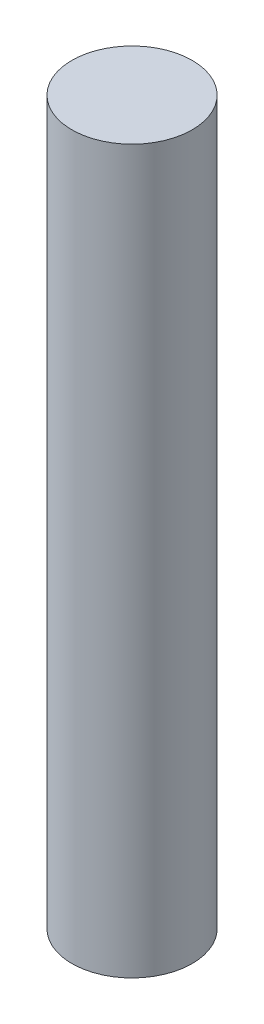
ISO-10303-21;
HEADER;
FILE_DESCRIPTION(('STEP AP214'),'2;1');
FILE_NAME('part.step','',(''),(''),'','','');
FILE_SCHEMA(('AUTOMOTIVE_DESIGN { 1 0 10303 214 1 1 1 1 }'));
ENDSEC;
DATA;
#1=APPLICATION_CONTEXT('core data for automotive mechanical design processes');
#2=APPLICATION_PROTOCOL_DEFINITION('international standard','automotive_design',2000,#1);
#3=PRODUCT_CONTEXT('',#1,'mechanical');
#4=PRODUCT('Part','Part','',(#3));
#5=PRODUCT_RELATED_PRODUCT_CATEGORY('part','',(#4));
#6=PRODUCT_DEFINITION_FORMATION('','',#4);
#7=PRODUCT_DEFINITION_CONTEXT('part definition',#1,'design');
#8=PRODUCT_DEFINITION('design','',#6,#7);
#9=PRODUCT_DEFINITION_SHAPE('','',#8);
#10=(LENGTH_UNIT() NAMED_UNIT(*) SI_UNIT(.MILLI.,.METRE.));
#11=(NAMED_UNIT(*) PLANE_ANGLE_UNIT() SI_UNIT($,.RADIAN.));
#12=(NAMED_UNIT(*) SI_UNIT($,.STERADIAN.) SOLID_ANGLE_UNIT());
#13=UNCERTAINTY_MEASURE_WITH_UNIT(LENGTH_MEASURE(1.E-05),#10,'distance_accuracy_value','');
#14=(GEOMETRIC_REPRESENTATION_CONTEXT(3) GLOBAL_UNCERTAINTY_ASSIGNED_CONTEXT((#13)) GLOBAL_UNIT_ASSIGNED_CONTEXT((#10,
#11,#12)) REPRESENTATION_CONTEXT('',''));
#15=CARTESIAN_POINT('',(0.,0.,0.));
#16=DIRECTION('',(0.,0.,1.));
#17=DIRECTION('',(1.,0.,0.));
#18=AXIS2_PLACEMENT_3D('',#15,#16,#17);
#19=CARTESIAN_POINT('',(0.,38.1,0.));
#20=DIRECTION('',(0.,-1.,0.));
#21=DIRECTION('',(0.,0.,-1.));
#22=AXIS2_PLACEMENT_3D('',#19,#20,#21);
#23=CYLINDRICAL_SURFACE('',#22,3.175);
#24=CARTESIAN_POINT('',(0.,38.1,0.));
#25=DIRECTION('',(0.,1.,0.));
#26=DIRECTION('',(0.,0.,1.));
#27=AXIS2_PLACEMENT_3D('',#24,#25,#26);
#28=CIRCLE('',#27,3.175);
#29=CARTESIAN_POINT('',(0.,38.1,-3.175));
#30=VERTEX_POINT('',#29);
#31=EDGE_CURVE('E10',#30,#30,#28,.T.);
#32=CARTESIAN_POINT('',(0.,0.,0.));
#33=DIRECTION('',(0.,1.,0.));
#34=DIRECTION('',(0.,0.,1.));
#35=AXIS2_PLACEMENT_3D('',#32,#33,#34);
#36=CIRCLE('',#35,3.175);
#37=CARTESIAN_POINT('',(0.,0.,-3.175));
#38=VERTEX_POINT('',#37);
#39=EDGE_CURVE('E40',#38,#38,#36,.T.);
#40=CARTESIAN_POINT('',(0.,38.1,-3.175));
#41=CARTESIAN_POINT('',(0.,37.703125,-3.175));
#42=CARTESIAN_POINT('',(0.,37.30625,-3.175));
#43=CARTESIAN_POINT('',(0.,36.5125,-3.175));
#44=CARTESIAN_POINT('',(0.,36.115625,-3.175));
#45=CARTESIAN_POINT('',(0.,35.321875,-3.175));
#46=CARTESIAN_POINT('',(0.,34.925,-3.175));
#47=CARTESIAN_POINT('',(0.,34.13125,-3.175));
#48=CARTESIAN_POINT('',(0.,33.734375,-3.175));
#49=CARTESIAN_POINT('',(0.,32.940625,-3.175));
#50=CARTESIAN_POINT('',(0.,32.54375,-3.175));
#51=CARTESIAN_POINT('',(0.,31.75,-3.175));
#52=CARTESIAN_POINT('',(0.,31.353125,-3.175));
#53=CARTESIAN_POINT('',(0.,30.559375,-3.175));
#54=CARTESIAN_POINT('',(0.,30.1625,-3.175));
#55=CARTESIAN_POINT('',(0.,29.36875,-3.175));
#56=CARTESIAN_POINT('',(0.,28.971875,-3.175));
#57=CARTESIAN_POINT('',(0.,28.178125,-3.175));
#58=CARTESIAN_POINT('',(0.,27.78125,-3.175));
#59=CARTESIAN_POINT('',(0.,26.9875,-3.175));
#60=CARTESIAN_POINT('',(0.,26.590625,-3.175));
#61=CARTESIAN_POINT('',(0.,25.796875,-3.175));
#62=CARTESIAN_POINT('',(0.,25.4,-3.175));
#63=CARTESIAN_POINT('',(0.,24.60625,-3.175));
#64=CARTESIAN_POINT('',(0.,24.209375,-3.175));
#65=CARTESIAN_POINT('',(0.,23.415625,-3.175));
#66=CARTESIAN_POINT('',(0.,23.01875,-3.175));
#67=CARTESIAN_POINT('',(0.,22.225,-3.175));
#68=CARTESIAN_POINT('',(0.,21.828125,-3.175));
#69=CARTESIAN_POINT('',(0.,21.034375,-3.175));
#70=CARTESIAN_POINT('',(0.,20.6375,-3.175));
#71=CARTESIAN_POINT('',(0.,19.84375,-3.175));
#72=CARTESIAN_POINT('',(0.,19.446875,-3.175));
#73=CARTESIAN_POINT('',(0.,18.653125,-3.175));
#74=CARTESIAN_POINT('',(0.,18.25625,-3.175));
#75=CARTESIAN_POINT('',(0.,17.4625,-3.175));
#76=CARTESIAN_POINT('',(0.,17.065625,-3.175));
#77=CARTESIAN_POINT('',(0.,16.271875,-3.175));
#78=CARTESIAN_POINT('',(0.,15.875,-3.175));
#79=CARTESIAN_POINT('',(0.,15.08125,-3.175));
#80=CARTESIAN_POINT('',(0.,14.684375,-3.175));
#81=CARTESIAN_POINT('',(0.,13.890625,-3.175));
#82=CARTESIAN_POINT('',(0.,13.49375,-3.175));
#83=CARTESIAN_POINT('',(0.,12.7,-3.175));
#84=CARTESIAN_POINT('',(0.,12.303125,-3.175));
#85=CARTESIAN_POINT('',(0.,11.509375,-3.175));
#86=CARTESIAN_POINT('',(0.,11.1125,-3.175));
#87=CARTESIAN_POINT('',(0.,10.31875,-3.175));
#88=CARTESIAN_POINT('',(0.,9.921875,-3.175));
#89=CARTESIAN_POINT('',(0.,9.128125,-3.175));
#90=CARTESIAN_POINT('',(0.,8.73125,-3.175));
#91=CARTESIAN_POINT('',(0.,7.9375,-3.175));
#92=CARTESIAN_POINT('',(0.,7.540625,-3.175));
#93=CARTESIAN_POINT('',(0.,6.746875,-3.175));
#94=CARTESIAN_POINT('',(0.,6.35,-3.175));
#95=CARTESIAN_POINT('',(0.,5.55625,-3.175));
#96=CARTESIAN_POINT('',(0.,5.159375,-3.175));
#97=CARTESIAN_POINT('',(0.,4.365625,-3.175));
#98=CARTESIAN_POINT('',(0.,3.96875,-3.175));
#99=CARTESIAN_POINT('',(0.,3.175,-3.175));
#100=CARTESIAN_POINT('',(0.,2.778125,-3.175));
#101=CARTESIAN_POINT('',(0.,1.984375,-3.175));
#102=CARTESIAN_POINT('',(0.,1.5875,-3.175));
#103=CARTESIAN_POINT('',(0.,0.79375,-3.175));
#104=CARTESIAN_POINT('',(0.,0.396875,-3.175));
#105=CARTESIAN_POINT('',(0.,0.,-3.175));
#106=B_SPLINE_CURVE_WITH_KNOTS('',3,(#40,#41,#42,#43,#44,#45,#46,#47,#48,#49,#50,#51,#52,#53,
#54,#55,#56,#57,#58,#59,#60,#61,#62,#63,#64,#65,#66,#67,#68,#69,#70,#71,#72,#73,#74,#75,#76,#77,
#78,#79,#80,#81,#82,#83,#84,#85,#86,#87,#88,#89,#90,#91,#92,#93,#94,#95,#96,#97,#98,#99,#100,
#101,#102,#103,#104,#105),.UNSPECIFIED.,.F.,.F.,(4,2,2,2,2,2,2,2,2,2,2,2,2,2,2,2,2,2,2,2,2,2,2,
2,2,2,2,2,2,2,2,2,4),(0.,1.19062499999999,2.38124999999999,3.571875,4.7625,5.953125,7.14375,
8.33437499999999,9.525,10.715625,11.90625,13.096875,14.2875,15.478125,16.66875,17.859375,19.05,
20.240625,21.43125,22.621875,23.8125,25.003125,26.19375,27.384375,28.575,29.765625,30.95625,
32.146875,33.3375,34.528125,35.71875,36.909375,38.1),.UNSPECIFIED.);
#107=EDGE_CURVE('BSEAM37',#30,#38,#106,.T.);
#108=ORIENTED_EDGE('',*,*,#31,.F.);
#109=ORIENTED_EDGE('',*,*,#39,.T.);
#110=ORIENTED_EDGE('',*,*,#107,.T.);
#111=ORIENTED_EDGE('',*,*,#107,.F.);
#112=EDGE_LOOP('',(#108,#110,#109,#111));
#113=FACE_BOUND('',#112,.T.);
#114=ADVANCED_FACE('F37',(#113),#23,.T.);
#115=CARTESIAN_POINT('',(0.,38.1,0.));
#116=DIRECTION('',(0.,1.,0.));
#117=DIRECTION('',(0.,0.,1.));
#118=AXIS2_PLACEMENT_3D('',#115,#116,#117);
#119=PLANE('',#118);
#120=ORIENTED_EDGE('',*,*,#31,.T.);
#121=EDGE_LOOP('',(#120));
#122=FACE_BOUND('',#121,.T.);
#123=ADVANCED_FACE('F54',(#122),#119,.T.);
#124=CARTESIAN_POINT('',(0.,0.,0.));
#125=DIRECTION('',(0.,1.,0.));
#126=DIRECTION('',(0.,0.,1.));
#127=AXIS2_PLACEMENT_3D('',#124,#125,#126);
#128=PLANE('',#127);
#129=ORIENTED_EDGE('',*,*,#39,.F.);
#130=EDGE_LOOP('',(#129));
#131=FACE_BOUND('',#130,.T.);
#132=ADVANCED_FACE('F52',(#131),#128,.F.);
#133=CLOSED_SHELL('',(#114,#123,#132));
#134=MANIFOLD_SOLID_BREP('B2',#133);
#135=ADVANCED_BREP_SHAPE_REPRESENTATION('',(#18,#134),#14);
#136=SHAPE_DEFINITION_REPRESENTATION(#9,#135);
ENDSEC;
END-ISO-10303-21;
